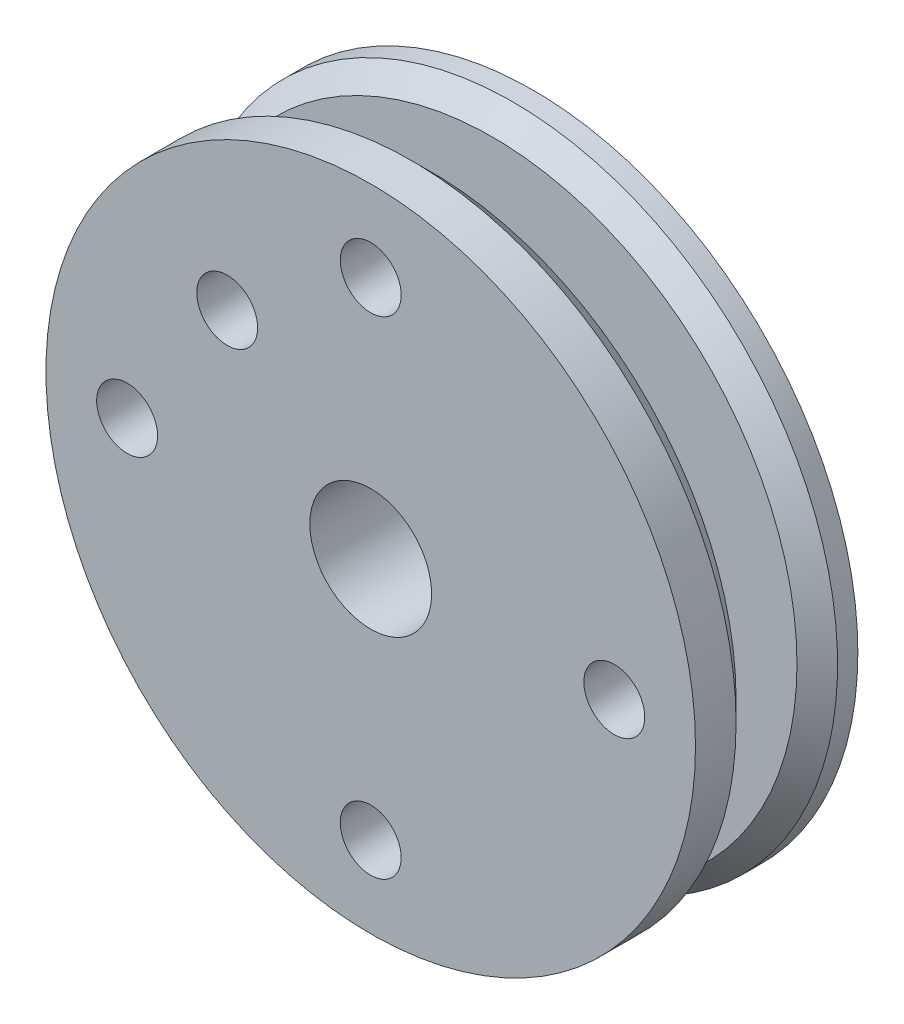
ISO-10303-21;
HEADER;
FILE_DESCRIPTION(('STEP AP214'),'2;1');
FILE_NAME('part.step','',(''),(''),'','','');
FILE_SCHEMA(('AUTOMOTIVE_DESIGN { 1 0 10303 214 1 1 1 1 }'));
ENDSEC;
DATA;
#1=APPLICATION_CONTEXT('core data for automotive mechanical design processes');
#2=APPLICATION_PROTOCOL_DEFINITION('international standard','automotive_design',2000,#1);
#3=PRODUCT_CONTEXT('',#1,'mechanical');
#4=PRODUCT('Part','Part','',(#3));
#5=PRODUCT_RELATED_PRODUCT_CATEGORY('part','',(#4));
#6=PRODUCT_DEFINITION_FORMATION('','',#4);
#7=PRODUCT_DEFINITION_CONTEXT('part definition',#1,'design');
#8=PRODUCT_DEFINITION('design','',#6,#7);
#9=PRODUCT_DEFINITION_SHAPE('','',#8);
#10=(LENGTH_UNIT() NAMED_UNIT(*) SI_UNIT(.MILLI.,.METRE.));
#11=(NAMED_UNIT(*) PLANE_ANGLE_UNIT() SI_UNIT($,.RADIAN.));
#12=(NAMED_UNIT(*) SI_UNIT($,.STERADIAN.) SOLID_ANGLE_UNIT());
#13=UNCERTAINTY_MEASURE_WITH_UNIT(LENGTH_MEASURE(1.E-05),#10,'distance_accuracy_value','');
#14=(GEOMETRIC_REPRESENTATION_CONTEXT(3) GLOBAL_UNCERTAINTY_ASSIGNED_CONTEXT((#13)) GLOBAL_UNIT_ASSIGNED_CONTEXT((#10,
#11,#12)) REPRESENTATION_CONTEXT('',''));
#15=CARTESIAN_POINT('',(0.,0.,0.));
#16=DIRECTION('',(0.,0.,1.));
#17=DIRECTION('',(1.,0.,0.));
#18=AXIS2_PLACEMENT_3D('',#15,#16,#17);
#19=CARTESIAN_POINT('',(0.,0.,4.));
#20=DIRECTION('',(0.,0.,-1.));
#21=DIRECTION('',(-1.,0.,0.));
#22=AXIS2_PLACEMENT_3D('',#19,#20,#21);
#23=CYLINDRICAL_SURFACE('',#22,8.);
#24=CARTESIAN_POINT('',(0.,0.,3.));
#25=DIRECTION('',(0.,0.,1.));
#26=DIRECTION('',(1.,0.,0.));
#27=AXIS2_PLACEMENT_3D('',#24,#25,#26);
#28=CIRCLE('',#27,8.);
#29=CARTESIAN_POINT('',(8.,0.,3.));
#30=VERTEX_POINT('',#29);
#31=EDGE_CURVE('E11',#30,#30,#28,.T.);
#32=ORIENTED_EDGE('',*,*,#31,.T.);
#33=EDGE_LOOP('',(#32));
#34=FACE_BOUND('',#33,.T.);
#35=CARTESIAN_POINT('',(0.,0.,4.));
#36=DIRECTION('',(0.,0.,1.));
#37=DIRECTION('',(1.,0.,0.));
#38=AXIS2_PLACEMENT_3D('',#35,#36,#37);
#39=CIRCLE('',#38,8.);
#40=CARTESIAN_POINT('',(8.,0.,4.));
#41=VERTEX_POINT('',#40);
#42=EDGE_CURVE('E71',#41,#41,#39,.T.);
#43=ORIENTED_EDGE('',*,*,#42,.F.);
#44=EDGE_LOOP('',(#43));
#45=FACE_BOUND('',#44,.T.);
#46=ADVANCED_FACE('F38',(#34,#45),#23,.T.);
#47=CARTESIAN_POINT('',(0.,0.,0.499999999999998));
#48=DIRECTION('',(0.,0.,-1.));
#49=DIRECTION('',(-1.,0.,0.));
#50=AXIS2_PLACEMENT_3D('',#47,#48,#49);
#51=CIRCLE('',#50,8.);
#52=CARTESIAN_POINT('',(-8.,0.,0.499999999999998));
#53=VERTEX_POINT('',#52);
#54=EDGE_CURVE('E105',#53,#53,#51,.T.);
#55=ORIENTED_EDGE('',*,*,#54,.T.);
#56=EDGE_LOOP('',(#55));
#57=FACE_BOUND('',#56,.T.);
#58=CARTESIAN_POINT('',(0.,0.,0.));
#59=DIRECTION('',(0.,0.,1.));
#60=DIRECTION('',(1.,0.,0.));
#61=AXIS2_PLACEMENT_3D('',#58,#59,#60);
#62=CIRCLE('',#61,8.);
#63=CARTESIAN_POINT('',(8.,0.,0.));
#64=VERTEX_POINT('',#63);
#65=EDGE_CURVE('E95',#64,#64,#62,.T.);
#66=ORIENTED_EDGE('',*,*,#65,.T.);
#67=EDGE_LOOP('',(#66));
#68=FACE_BOUND('',#67,.T.);
#69=ADVANCED_FACE('F128',(#57,#68),#23,.T.);
#70=CARTESIAN_POINT('',(0.,0.,4.));
#71=DIRECTION('',(0.,0.,1.));
#72=DIRECTION('',(1.,0.,0.));
#73=AXIS2_PLACEMENT_3D('',#70,#71,#72);
#74=PLANE('',#73);
#75=CARTESIAN_POINT('',(-3.53553390593274,3.53553390593273,4.));
#76=DIRECTION('',(0.,0.,1.));
#77=DIRECTION('',(1.,0.,0.));
#78=AXIS2_PLACEMENT_3D('',#75,#76,#77);
#79=CIRCLE('',#78,0.749999999999999);
#80=CARTESIAN_POINT('',(-2.78553390593274,3.53553390593273,4.));
#81=VERTEX_POINT('',#80);
#82=EDGE_CURVE('E81',#81,#81,#79,.T.);
#83=ORIENTED_EDGE('',*,*,#82,.F.);
#84=EDGE_LOOP('',(#83));
#85=FACE_BOUND('',#84,.T.);
#86=CARTESIAN_POINT('',(-6.,0.,4.));
#87=DIRECTION('',(0.,0.,1.));
#88=DIRECTION('',(1.,0.,0.));
#89=AXIS2_PLACEMENT_3D('',#86,#87,#88);
#90=CIRCLE('',#89,0.750000000000116);
#91=CARTESIAN_POINT('',(-5.24999999999988,0.,4.));
#92=VERTEX_POINT('',#91);
#93=EDGE_CURVE('E177',#92,#92,#90,.F.);
#94=ORIENTED_EDGE('',*,*,#93,.T.);
#95=EDGE_LOOP('',(#94));
#96=FACE_BOUND('',#95,.T.);
#97=CARTESIAN_POINT('',(0.,-6.,4.));
#98=DIRECTION('',(0.,0.,1.));
#99=DIRECTION('',(1.,0.,0.));
#100=AXIS2_PLACEMENT_3D('',#97,#98,#99);
#101=CIRCLE('',#100,0.750000000000337);
#102=CARTESIAN_POINT('',(0.750000000000338,-6.,4.));
#103=VERTEX_POINT('',#102);
#104=EDGE_CURVE('E171',#103,#103,#101,.F.);
#105=ORIENTED_EDGE('',*,*,#104,.T.);
#106=EDGE_LOOP('',(#105));
#107=FACE_BOUND('',#106,.T.);
#108=CARTESIAN_POINT('',(6.,0.,4.));
#109=DIRECTION('',(0.,0.,1.));
#110=DIRECTION('',(1.,0.,0.));
#111=AXIS2_PLACEMENT_3D('',#108,#109,#110);
#112=CIRCLE('',#111,0.750000000000219);
#113=CARTESIAN_POINT('',(6.75000000000022,0.,4.));
#114=VERTEX_POINT('',#113);
#115=EDGE_CURVE('E165',#114,#114,#112,.F.);
#116=ORIENTED_EDGE('',*,*,#115,.T.);
#117=EDGE_LOOP('',(#116));
#118=FACE_BOUND('',#117,.T.);
#119=CARTESIAN_POINT('',(0.,6.,4.));
#120=DIRECTION('',(0.,0.,1.));
#121=DIRECTION('',(1.,0.,0.));
#122=AXIS2_PLACEMENT_3D('',#119,#120,#121);
#123=CIRCLE('',#122,0.75);
#124=CARTESIAN_POINT('',(0.75,6.,4.));
#125=VERTEX_POINT('',#124);
#126=EDGE_CURVE('E159',#125,#125,#123,.F.);
#127=ORIENTED_EDGE('',*,*,#126,.T.);
#128=EDGE_LOOP('',(#127));
#129=FACE_BOUND('',#128,.T.);
#130=CARTESIAN_POINT('',(0.,0.,4.));
#131=DIRECTION('',(0.,0.,-1.));
#132=DIRECTION('',(-1.,0.,0.));
#133=AXIS2_PLACEMENT_3D('',#130,#131,#132);
#134=CIRCLE('',#133,1.5);
#135=CARTESIAN_POINT('',(-1.5,0.,4.));
#136=VERTEX_POINT('',#135);
#137=EDGE_CURVE('E92',#136,#136,#134,.T.);
#138=ORIENTED_EDGE('',*,*,#137,.T.);
#139=EDGE_LOOP('',(#138));
#140=FACE_BOUND('',#139,.T.);
#141=ORIENTED_EDGE('',*,*,#42,.T.);
#142=EDGE_LOOP('',(#141));
#143=FACE_BOUND('',#142,.T.);
#144=ADVANCED_FACE('F134',(#85,#96,#107,#118,#129,#140,#143),#74,.T.);
#145=CARTESIAN_POINT('',(0.,0.,0.));
#146=DIRECTION('',(0.,0.,1.));
#147=DIRECTION('',(1.,0.,0.));
#148=AXIS2_PLACEMENT_3D('',#145,#146,#147);
#149=PLANE('',#148);
#150=CARTESIAN_POINT('',(-3.53553390593274,3.53553390593273,0.));
#151=DIRECTION('',(0.,0.,-1.));
#152=DIRECTION('',(-1.,0.,0.));
#153=AXIS2_PLACEMENT_3D('',#150,#151,#152);
#154=CIRCLE('',#153,0.75);
#155=CARTESIAN_POINT('',(-4.28553390593274,3.53553390593273,0.));
#156=VERTEX_POINT('',#155);
#157=EDGE_CURVE('E76',#156,#156,#154,.T.);
#158=ORIENTED_EDGE('',*,*,#157,.F.);
#159=EDGE_LOOP('',(#158));
#160=FACE_BOUND('',#159,.T.);
#161=CARTESIAN_POINT('',(0.,0.,0.));
#162=DIRECTION('',(0.,0.,-1.));
#163=DIRECTION('',(-1.,0.,0.));
#164=AXIS2_PLACEMENT_3D('',#161,#162,#163);
#165=CIRCLE('',#164,1.49999999999999);
#166=CARTESIAN_POINT('',(-1.49999999999999,0.,0.));
#167=VERTEX_POINT('',#166);
#168=EDGE_CURVE('E84',#167,#167,#165,.T.);
#169=ORIENTED_EDGE('',*,*,#168,.F.);
#170=EDGE_LOOP('',(#169));
#171=FACE_BOUND('',#170,.T.);
#172=ORIENTED_EDGE('',*,*,#65,.F.);
#173=EDGE_LOOP('',(#172));
#174=FACE_BOUND('',#173,.T.);
#175=ADVANCED_FACE('F138',(#160,#171,#174),#149,.F.);
#176=CARTESIAN_POINT('',(0.,0.,0.));
#177=DIRECTION('',(0.,0.,-1.));
#178=DIRECTION('',(-1.,0.,0.));
#179=AXIS2_PLACEMENT_3D('',#176,#177,#178);
#180=CYLINDRICAL_SURFACE('',#179,1.49999999999999);
#181=ORIENTED_EDGE('',*,*,#137,.F.);
#182=EDGE_LOOP('',(#181));
#183=FACE_BOUND('',#182,.T.);
#184=ORIENTED_EDGE('',*,*,#168,.T.);
#185=EDGE_LOOP('',(#184));
#186=FACE_BOUND('',#185,.T.);
#187=ADVANCED_FACE('F187',(#183,#186),#180,.F.);
#188=CARTESIAN_POINT('',(-4.5,0.,2.5));
#189=DIRECTION('',(0.,0.,1.));
#190=DIRECTION('',(1.,0.,0.));
#191=AXIS2_PLACEMENT_3D('',#188,#189,#190);
#192=PLANE('',#191);
#193=CARTESIAN_POINT('',(0.,6.,2.5));
#194=DIRECTION('',(0.,0.,1.));
#195=DIRECTION('',(1.,0.,0.));
#196=AXIS2_PLACEMENT_3D('',#193,#194,#195);
#197=CIRCLE('',#196,0.75);
#198=CARTESIAN_POINT('',(0.75,6.,2.5));
#199=VERTEX_POINT('',#198);
#200=EDGE_CURVE('E162',#199,#199,#197,.F.);
#201=ORIENTED_EDGE('',*,*,#200,.F.);
#202=EDGE_LOOP('',(#201));
#203=FACE_BOUND('',#202,.T.);
#204=CARTESIAN_POINT('',(6.,0.,2.5));
#205=DIRECTION('',(0.,0.,1.));
#206=DIRECTION('',(1.,0.,0.));
#207=AXIS2_PLACEMENT_3D('',#204,#205,#206);
#208=CIRCLE('',#207,0.750000000000219);
#209=CARTESIAN_POINT('',(6.75000000000022,0.,2.5));
#210=VERTEX_POINT('',#209);
#211=EDGE_CURVE('E168',#210,#210,#208,.F.);
#212=ORIENTED_EDGE('',*,*,#211,.F.);
#213=EDGE_LOOP('',(#212));
#214=FACE_BOUND('',#213,.T.);
#215=CARTESIAN_POINT('',(0.,-6.,2.5));
#216=DIRECTION('',(0.,0.,1.));
#217=DIRECTION('',(1.,0.,0.));
#218=AXIS2_PLACEMENT_3D('',#215,#216,#217);
#219=CIRCLE('',#218,0.750000000000337);
#220=CARTESIAN_POINT('',(0.750000000000338,-6.,2.5));
#221=VERTEX_POINT('',#220);
#222=EDGE_CURVE('E174',#221,#221,#219,.F.);
#223=ORIENTED_EDGE('',*,*,#222,.F.);
#224=EDGE_LOOP('',(#223));
#225=FACE_BOUND('',#224,.T.);
#226=CARTESIAN_POINT('',(-6.,0.,2.5));
#227=DIRECTION('',(0.,0.,1.));
#228=DIRECTION('',(1.,0.,0.));
#229=AXIS2_PLACEMENT_3D('',#226,#227,#228);
#230=CIRCLE('',#229,0.750000000000116);
#231=CARTESIAN_POINT('',(-5.24999999999988,0.,2.5));
#232=VERTEX_POINT('',#231);
#233=EDGE_CURVE('E180',#232,#232,#230,.F.);
#234=ORIENTED_EDGE('',*,*,#233,.F.);
#235=EDGE_LOOP('',(#234));
#236=FACE_BOUND('',#235,.T.);
#237=CARTESIAN_POINT('',(0.,0.,2.5));
#238=DIRECTION('',(0.,0.,1.));
#239=DIRECTION('',(1.,0.,0.));
#240=AXIS2_PLACEMENT_3D('',#237,#238,#239);
#241=CIRCLE('',#240,7.5);
#242=CARTESIAN_POINT('',(7.5,0.,2.5));
#243=VERTEX_POINT('',#242);
#244=EDGE_CURVE('E47',#243,#243,#241,.F.);
#245=ORIENTED_EDGE('',*,*,#244,.T.);
#246=EDGE_LOOP('',(#245));
#247=FACE_BOUND('',#246,.T.);
#248=CARTESIAN_POINT('',(0.,0.,2.5));
#249=DIRECTION('',(0.,0.,-1.));
#250=DIRECTION('',(-1.,0.,0.));
#251=AXIS2_PLACEMENT_3D('',#248,#249,#250);
#252=CIRCLE('',#251,4.5);
#253=CARTESIAN_POINT('',(-2.78553503621767,3.5342318206371,2.5));
#254=VERTEX_POINT('',#253);
#255=CARTESIAN_POINT('',(-3.5342318206371,2.78553503621766,2.5));
#256=VERTEX_POINT('',#255);
#257=EDGE_CURVE('E80',#254,#256,#252,.T.);
#258=ORIENTED_EDGE('',*,*,#257,.F.);
#259=CARTESIAN_POINT('',(-3.53553390593274,3.53553390593273,2.5));
#260=DIRECTION('',(0.,0.,1.));
#261=DIRECTION('',(1.,0.,0.));
#262=AXIS2_PLACEMENT_3D('',#259,#260,#261);
#263=CIRCLE('',#262,0.749999999999999);
#264=EDGE_CURVE('E53',#254,#256,#263,.T.);
#265=ORIENTED_EDGE('',*,*,#264,.T.);
#266=EDGE_LOOP('',(#258,#265));
#267=FACE_BOUND('',#266,.T.);
#268=ADVANCED_FACE('F125',(#203,#214,#225,#236,#247,#267),#192,.F.);
#269=CARTESIAN_POINT('',(0.,0.,1.75));
#270=DIRECTION('',(0.,0.,-1.));
#271=DIRECTION('',(-1.,0.,0.));
#272=AXIS2_PLACEMENT_3D('',#269,#270,#271);
#273=TOROIDAL_SURFACE('',#272,4.5,0.75);
#274=CARTESIAN_POINT('',(0.,0.,1.));
#275=DIRECTION('',(0.,0.,-1.));
#276=DIRECTION('',(-1.,0.,0.));
#277=AXIS2_PLACEMENT_3D('',#274,#275,#276);
#278=CIRCLE('',#277,4.5);
#279=CARTESIAN_POINT('',(-2.78553503621767,3.5342318206371,1.));
#280=VERTEX_POINT('',#279);
#281=CARTESIAN_POINT('',(-3.53423182063711,2.78553503621766,1.));
#282=VERTEX_POINT('',#281);
#283=EDGE_CURVE('E75',#280,#282,#278,.T.);
#284=ORIENTED_EDGE('',*,*,#283,.F.);
#285=CARTESIAN_POINT('',(-4.04510268999947,2.98522521591183,1.21672392239653));
#286=CARTESIAN_POINT('',(-4.06717729077215,3.00566717869359,1.24629697173725));
#287=CARTESIAN_POINT('',(-4.0862862095507,3.0258323829536,1.27833603759019));
#288=CARTESIAN_POINT('',(-4.1191133993598,3.06376132873869,1.34646447260618));
#289=CARTESIAN_POINT('',(-4.13281249623848,3.08151638461191,1.38256767576369));
#290=CARTESIAN_POINT('',(-4.1554031884755,3.11288099014642,1.45789981383957));
#291=CARTESIAN_POINT('',(-4.16430077443588,3.12649569620781,1.49712478341001));
#292=CARTESIAN_POINT('',(-4.17784861333492,3.14811017818971,1.57774227922166));
#293=CARTESIAN_POINT('',(-4.18250611800452,3.15611953538491,1.61913097615957));
#294=CARTESIAN_POINT('',(-4.18787702646684,3.16542867971578,1.70197036479742));
#295=CARTESIAN_POINT('',(-4.18867701745432,3.16687572220384,1.74339860395725));
#296=CARTESIAN_POINT('',(-4.18662555308701,3.16326584899753,1.82588256795789));
#297=CARTESIAN_POINT('',(-4.18377348855823,3.15820784824155,1.86693822950111));
#298=CARTESIAN_POINT('',(-4.17447896139487,3.14269354716693,1.94515781962672));
#299=CARTESIAN_POINT('',(-4.16824553342278,3.13255393113343,1.98241110778135));
#300=CARTESIAN_POINT('',(-4.15197356728305,3.10807962130967,2.05465920475893));
#301=CARTESIAN_POINT('',(-4.14193201512538,3.09374160669523,2.0896521989017));
#302=CARTESIAN_POINT('',(-4.1166190052481,3.06087327537419,2.15927957845452));
#303=CARTESIAN_POINT('',(-4.1010032939683,3.04210457661932,2.19367717671397));
#304=CARTESIAN_POINT('',(-4.06415456070398,3.00282143975847,2.2582020631693));
#305=CARTESIAN_POINT('',(-4.04292710017696,2.98230874359962,2.28833353411007));
#306=CARTESIAN_POINT('',(-3.99912113127719,2.94541529631747,2.33805072956879));
#307=CARTESIAN_POINT('',(-3.97760395505507,2.92900508830982,2.3585482635332));
#308=CARTESIAN_POINT('',(-3.93064778944032,2.89742499802712,2.39563363757993));
#309=CARTESIAN_POINT('',(-3.90521258139886,2.8822539412061,2.4122252087382));
#310=CARTESIAN_POINT('',(-3.85064921985029,2.8542513201113,2.44115602073586));
#311=CARTESIAN_POINT('',(-3.82150294592376,2.84143204405778,2.45347321013864));
#312=CARTESIAN_POINT('',(-3.7604471806025,2.81931691558425,2.47359601928976));
#313=CARTESIAN_POINT('',(-3.72853806179355,2.81002058898023,2.48140224628153));
#314=CARTESIAN_POINT('',(-3.66577591496567,2.79628814527007,2.49235567473132));
#315=CARTESIAN_POINT('',(-3.63505178051287,2.79151525369191,2.4958331827439));
#316=CARTESIAN_POINT('',(-3.57307011608744,2.78582695476155,2.49983368003298));
#317=CARTESIAN_POINT('',(-3.54181245055192,2.78491254289812,2.50035590685804));
#318=CARTESIAN_POINT('',(-3.47701316612066,2.78706323291142,2.49915450269042));
#319=CARTESIAN_POINT('',(-3.44348668957354,2.79044919140579,2.49724975600017));
#320=CARTESIAN_POINT('',(-3.37729731572848,2.80164667340357,2.49192636124723));
#321=CARTESIAN_POINT('',(-3.34463524817528,2.8094622983889,2.48850631078788));
#322=CARTESIAN_POINT('',(-3.27469683868258,2.83123008816232,2.4805183400338));
#323=CARTESIAN_POINT('',(-3.2377010772679,2.84605702603195,2.4758553861769));
#324=CARTESIAN_POINT('',(-3.16643750977311,2.88143145838997,2.46750247461733));
#325=CARTESIAN_POINT('',(-3.13216919522129,2.90197788337997,2.46381233525707));
#326=CARTESIAN_POINT('',(-3.06543920355788,2.94963389251219,2.45852407464223));
#327=CARTESIAN_POINT('',(-3.03317678936771,2.97703937141084,2.45705048564348));
#328=CARTESIAN_POINT('',(-2.97373356141047,3.03687712770187,2.45716647955456));
#329=CARTESIAN_POINT('',(-2.94655151278459,3.0693081800388,2.45875531703088));
#330=CARTESIAN_POINT('',(-2.89977892924593,3.13571898045636,2.46417386186616));
#331=CARTESIAN_POINT('',(-2.8797936333016,3.16943689841916,2.46784115376258));
#332=CARTESIAN_POINT('',(-2.84531863957078,3.23951031220025,2.47608145983493));
#333=CARTESIAN_POINT('',(-2.83083570935943,3.27586899097725,2.48065557890321));
#334=CARTESIAN_POINT('',(-2.80682718041667,3.35320500797966,2.48948146570783));
#335=CARTESIAN_POINT('',(-2.7977412633187,3.39432569251424,2.49368523992095));
#336=CARTESIAN_POINT('',(-2.78659356228482,3.47768168250918,2.49928041775109));
#337=CARTESIAN_POINT('',(-2.78451858382805,3.51991474328379,2.50067710227426));
#338=CARTESIAN_POINT('',(-2.78713718268779,3.59425487730568,2.4989042942914));
#339=CARTESIAN_POINT('',(-2.79037129233799,3.62643664586311,2.49671955089322));
#340=CARTESIAN_POINT('',(-2.80084957114507,3.68968833013551,2.48878781496174));
#341=CARTESIAN_POINT('',(-2.80809041842573,3.7207591442246,2.4830437728733));
#342=CARTESIAN_POINT('',(-2.82610770476633,3.78089606390069,2.46754033247466));
#343=CARTESIAN_POINT('',(-2.83689268801896,3.80995711737114,2.4577712159372));
#344=CARTESIAN_POINT('',(-2.86117178612405,3.86514863908592,2.4341618669928));
#345=CARTESIAN_POINT('',(-2.87466688551493,3.89127803691776,2.42032015422949));
#346=CARTESIAN_POINT('',(-2.90290618356513,3.93931068747708,2.3893289877015));
#347=CARTESIAN_POINT('',(-2.91759899338191,3.96131946207919,2.37229477228787));
#348=CARTESIAN_POINT('',(-2.94764163949713,4.00192591903944,2.33505761634642));
#349=CARTESIAN_POINT('',(-2.96299165742102,4.02052265084521,2.31485379570551));
#350=CARTESIAN_POINT('',(-2.99537550246075,4.05648021175623,2.26901690010011));
#351=CARTESIAN_POINT('',(-3.01238208835771,4.07340181339751,2.2430212492422));
#352=CARTESIAN_POINT('',(-3.04503994573193,4.10334327447574,2.18808610874205));
#353=CARTESIAN_POINT('',(-3.06068999057167,4.11635962827494,2.15914400516968));
#354=CARTESIAN_POINT('',(-3.09204061345144,4.14073783664359,2.09376660112294));
#355=CARTESIAN_POINT('',(-3.10731525390477,4.15146279789241,2.05688623028379));
#356=CARTESIAN_POINT('',(-3.13318441015181,4.16866728283483,1.9805791236431));
#357=CARTESIAN_POINT('',(-3.1437796792331,4.17514748993234,1.94115279886268));
#358=CARTESIAN_POINT('',(-3.15928105293146,4.1843943395421,1.85977707540637));
#359=CARTESIAN_POINT('',(-3.16404797695366,4.18707037229092,1.81779019746059));
#360=CARTESIAN_POINT('',(-3.16677771132177,4.18862060265157,1.7335381209336));
#361=CARTESIAN_POINT('',(-3.16474363590982,4.18749654036034,1.69127305858203));
#362=CARTESIAN_POINT('',(-3.15456462531577,4.18159218142042,1.6109771871636));
#363=CARTESIAN_POINT('',(-3.14688415948942,4.1770892734431,1.5728648433846));
#364=CARTESIAN_POINT('',(-3.12678365717724,4.16447184649935,1.49851912101326));
#365=CARTESIAN_POINT('',(-3.11435997592737,4.15635454937783,1.4622872117588));
#366=CARTESIAN_POINT('',(-3.08515431462919,4.13553071962134,1.39058275813385));
#367=CARTESIAN_POINT('',(-3.06817365423013,4.12260058008441,1.35525619085503));
#368=CARTESIAN_POINT('',(-3.03174108012698,4.09164775181131,1.28829833807845));
#369=CARTESIAN_POINT('',(-3.0122903289454,4.07362745385203,1.25666532760318));
#370=CARTESIAN_POINT('',(-2.97534124374876,4.03483220988724,1.20196976263148));
#371=CARTESIAN_POINT('',(-2.95794431428212,4.01478152917751,1.17832692433109));
#372=CARTESIAN_POINT('',(-2.92378476081976,3.97032860808841,1.1349963470142));
#373=CARTESIAN_POINT('',(-2.90702161586172,3.94593004021812,1.11530529967242));
#374=CARTESIAN_POINT('',(-2.87534759057314,3.89276784116333,1.08032389626391));
#375=CARTESIAN_POINT('',(-2.86045023172612,3.86397536335853,1.06506471409409));
#376=CARTESIAN_POINT('',(-2.83400879148971,3.80286778097585,1.0395067589304));
#377=CARTESIAN_POINT('',(-2.82246267866303,3.77055482682691,1.02920497838736));
#378=CARTESIAN_POINT('',(-2.80486443809347,3.70748779290853,1.01434511376668));
#379=CARTESIAN_POINT('',(-2.79832970647856,3.67698909486667,1.00925858798338));
#380=CARTESIAN_POINT('',(-2.78910512507472,3.61506102375054,1.00239184446209));
#381=CARTESIAN_POINT('',(-2.78641615516224,3.58363143937599,1.00061238332353));
#382=CARTESIAN_POINT('',(-2.78499427228183,3.51951620368477,0.9996389682565));
#383=CARTESIAN_POINT('',(-2.78640909336443,3.48682651698098,1.00054159619901));
#384=CARTESIAN_POINT('',(-2.79345719938838,3.42201296200657,1.00420947153978));
#385=CARTESIAN_POINT('',(-2.79909343582755,3.38988950572039,1.00697602200552));
#386=CARTESIAN_POINT('',(-2.81583577220437,3.32104727862002,1.01398448441842));
#387=CARTESIAN_POINT('',(-2.82774291223939,3.28454028832349,1.01840219669601));
#388=CARTESIAN_POINT('',(-2.85699734859988,3.21373094331484,1.02696636160819));
#389=CARTESIAN_POINT('',(-2.87434684488346,3.1794294869119,1.03111270372642));
#390=CARTESIAN_POINT('',(-2.91626498183428,3.11032673966265,1.03816717669049));
#391=CARTESIAN_POINT('',(-2.94139690234494,3.07584472976321,1.04090160468061));
#392=CARTESIAN_POINT('',(-2.99719966414057,3.01160278879755,1.04335485739385));
#393=CARTESIAN_POINT('',(-3.02786629216893,2.98183929794412,1.0430759665431));
#394=CARTESIAN_POINT('',(-3.09131478026896,2.92995263940438,1.03975240912155));
#395=CARTESIAN_POINT('',(-3.12378671324222,2.90743435531163,1.03690774561205));
#396=CARTESIAN_POINT('',(-3.19175641452373,2.86780072948001,1.02969099866979));
#397=CARTESIAN_POINT('',(-3.22725793386022,2.85069221270661,1.02531700035329));
#398=CARTESIAN_POINT('',(-3.30216614343711,2.82158133620605,1.01628807077745));
#399=CARTESIAN_POINT('',(-3.34167719675086,2.80984847778146,1.01162944341586));
#400=CARTESIAN_POINT('',(-3.42224517806732,2.79300215231008,1.00413746646274));
#401=CARTESIAN_POINT('',(-3.4633001190971,2.7878804578351,1.0013018503906));
#402=CARTESIAN_POINT('',(-3.53791500627077,2.78479405692953,0.999578218036754));
#403=CARTESIAN_POINT('',(-3.57140934792793,2.78564957681685,1.00003985816939));
#404=CARTESIAN_POINT('',(-3.63776441564927,2.7917895154876,1.00436143271604));
#405=CARTESIAN_POINT('',(-3.67062575866836,2.79706937265686,1.00821786720992));
#406=CARTESIAN_POINT('',(-3.73482084722557,2.811743044293,1.02003277948506));
#407=CARTESIAN_POINT('',(-3.76614730517106,2.82115470104564,1.02800907466642));
#408=CARTESIAN_POINT('',(-3.82607270332069,2.84335689387395,1.04835762265148));
#409=CARTESIAN_POINT('',(-3.85467041256352,2.85614894515731,1.06073184761685));
#410=CARTESIAN_POINT('',(-3.90646668933184,2.88307485928947,1.08870028417482));
#411=CARTESIAN_POINT('',(-3.92990271445303,2.89705290307507,1.10400971048353));
#412=CARTESIAN_POINT('',(-3.97341920730767,2.92607536763664,1.13793962240802));
#413=CARTESIAN_POINT('',(-3.99350357678928,2.94111851901041,1.15655620519008));
#414=CARTESIAN_POINT('',(-4.02364664675977,2.96590410785525,1.18940850176204));
#415=CARTESIAN_POINT('',(-4.03470373816088,2.97559537079514,1.2027925847936));
#416=CARTESIAN_POINT('',(-4.04510268999947,2.98522521591183,1.21672392239653));
#417=B_SPLINE_CURVE_WITH_KNOTS('',3,(#285,#286,#287,#288,#289,#290,#291,#292,#293,#294,#295,
#296,#297,#298,#299,#300,#301,#302,#303,#304,#305,#306,#307,#308,#309,#310,#311,#312,#313,#314,
#315,#316,#317,#318,#319,#320,#321,#322,#323,#324,#325,#326,#327,#328,#329,#330,#331,#332,#333,
#334,#335,#336,#337,#338,#339,#340,#341,#342,#343,#344,#345,#346,#347,#348,#349,#350,#351,#352,
#353,#354,#355,#356,#357,#358,#359,#360,#361,#362,#363,#364,#365,#366,#367,#368,#369,#370,#371,
#372,#373,#374,#375,#376,#377,#378,#379,#380,#381,#382,#383,#384,#385,#386,#387,#388,#389,#390,
#391,#392,#393,#394,#395,#396,#397,#398,#399,#400,#401,#402,#403,#404,#405,#406,#407,#408,#409,
#410,#411,#412,#413,#414,#415,#416),.UNSPECIFIED.,.T.,.F.,(4,2,2,2,2,2,2,2,2,2,2,2,2,2,2,2,2,2,
2,2,2,2,2,2,2,2,2,2,2,2,2,2,2,2,2,2,2,2,2,2,2,2,2,2,2,2,2,2,2,2,2,2,2,2,2,2,2,2,2,2,2,2,2,2,2,
4),(0.,0.126496903833787,0.253438213727164,0.380220777041031,0.506786096934219,
0.630496824075356,0.754228189230404,0.871061354340255,0.987987182234752,1.11395083759231,
1.23979012312185,1.34121249020596,1.4425375793331,1.54437789106712,1.64620449036685,
1.73965852740406,1.83313667413285,1.93401700617905,2.03499089750027,2.15486402992231,
2.27471476206649,2.40107604928899,2.52740658245367,2.64500844817787,2.76275449235544,
2.88910626730704,3.01522011655289,3.11205716687719,3.20881405228912,3.30580593147174,
3.40283311007897,3.49686650897118,3.59092606474479,3.69664952303365,3.80246760445911,
3.92591458193077,4.04934167959515,4.17566201184495,4.3019245087396,4.4188213866657,
4.53580827143898,4.6590953814622,4.78232468124989,4.88853326869141,4.99465256702092,
5.1015011728004,5.20828487384463,5.30265637599505,5.39704946606299,5.4948823477133,
5.5927836953591,5.70828108419208,5.82382522071032,5.95139045999282,6.07885899762425,
6.19717608403871,6.3156418492375,6.43952893997729,6.5632617072184,6.66337023521054,
6.76337567535369,6.86381728180085,6.96430398617975,7.05778194936397,7.15115032164688,
7.21074076336056),.UNSPECIFIED.);
#418=EDGE_CURVE('E65',#280,#282,#417,.T.);
#419=ORIENTED_EDGE('',*,*,#418,.T.);
#420=EDGE_LOOP('',(#284,#419));
#421=FACE_BOUND('',#420,.T.);
#422=ORIENTED_EDGE('',*,*,#257,.T.);
#423=EDGE_CURVE('E70',#256,#254,#417,.T.);
#424=ORIENTED_EDGE('',*,*,#423,.T.);
#425=EDGE_LOOP('',(#422,#424));
#426=FACE_BOUND('',#425,.T.);
#427=ADVANCED_FACE('F78',(#421,#426),#273,.F.);
#428=CARTESIAN_POINT('',(-8.,0.,1.));
#429=DIRECTION('',(0.,0.,-1.));
#430=DIRECTION('',(-1.,0.,0.));
#431=AXIS2_PLACEMENT_3D('',#428,#429,#430);
#432=PLANE('',#431);
#433=CARTESIAN_POINT('',(0.,0.,1.));
#434=DIRECTION('',(0.,0.,-1.));
#435=DIRECTION('',(-1.,0.,0.));
#436=AXIS2_PLACEMENT_3D('',#433,#434,#435);
#437=CIRCLE('',#436,7.5);
#438=CARTESIAN_POINT('',(-7.5,0.,1.));
#439=VERTEX_POINT('',#438);
#440=EDGE_CURVE('E151',#439,#439,#437,.F.);
#441=ORIENTED_EDGE('',*,*,#440,.T.);
#442=EDGE_LOOP('',(#441));
#443=FACE_BOUND('',#442,.T.);
#444=ORIENTED_EDGE('',*,*,#283,.T.);
#445=CARTESIAN_POINT('',(-3.53553390593274,3.53553390593273,1.));
#446=DIRECTION('',(0.,0.,-1.));
#447=DIRECTION('',(-1.,0.,0.));
#448=AXIS2_PLACEMENT_3D('',#445,#446,#447);
#449=CIRCLE('',#448,0.749999999999999);
#450=EDGE_CURVE('E60',#282,#280,#449,.T.);
#451=ORIENTED_EDGE('',*,*,#450,.T.);
#452=EDGE_LOOP('',(#444,#451));
#453=FACE_BOUND('',#452,.T.);
#454=ADVANCED_FACE('F74',(#443,#453),#432,.F.);
#455=CARTESIAN_POINT('',(-3.53553390593274,3.53553390593273,0.));
#456=DIRECTION('',(0.,0.,-1.));
#457=DIRECTION('',(-1.,0.,0.));
#458=AXIS2_PLACEMENT_3D('',#455,#456,#457);
#459=CYLINDRICAL_SURFACE('',#458,0.749999999999999);
#460=ORIENTED_EDGE('',*,*,#157,.T.);
#461=EDGE_LOOP('',(#460));
#462=FACE_BOUND('',#461,.T.);
#463=ORIENTED_EDGE('',*,*,#418,.F.);
#464=ORIENTED_EDGE('',*,*,#450,.F.);
#465=EDGE_LOOP('',(#463,#464));
#466=FACE_BOUND('',#465,.T.);
#467=ADVANCED_FACE('F66',(#462,#466),#459,.F.);
#468=ORIENTED_EDGE('',*,*,#82,.T.);
#469=EDGE_LOOP('',(#468));
#470=FACE_BOUND('',#469,.T.);
#471=ORIENTED_EDGE('',*,*,#423,.F.);
#472=ORIENTED_EDGE('',*,*,#264,.F.);
#473=EDGE_LOOP('',(#471,#472));
#474=FACE_BOUND('',#473,.T.);
#475=ADVANCED_FACE('F110',(#470,#474),#459,.F.);
#476=CARTESIAN_POINT('',(0.,0.,0.499999999999998));
#477=DIRECTION('',(0.,0.,-1.));
#478=DIRECTION('',(-1.,0.,0.));
#479=AXIS2_PLACEMENT_3D('',#476,#477,#478);
#480=CONICAL_SURFACE('',#479,8.,0.785398163397448);
#481=ORIENTED_EDGE('',*,*,#440,.F.);
#482=EDGE_LOOP('',(#481));
#483=FACE_BOUND('',#482,.T.);
#484=ORIENTED_EDGE('',*,*,#54,.F.);
#485=EDGE_LOOP('',(#484));
#486=FACE_BOUND('',#485,.T.);
#487=ADVANCED_FACE('F114',(#483,#486),#480,.T.);
#488=CARTESIAN_POINT('',(0.,0.,2.5));
#489=DIRECTION('',(0.,0.,1.));
#490=DIRECTION('',(1.,0.,0.));
#491=AXIS2_PLACEMENT_3D('',#488,#489,#490);
#492=CONICAL_SURFACE('',#491,7.5,0.785398163397445);
#493=ORIENTED_EDGE('',*,*,#31,.F.);
#494=EDGE_LOOP('',(#493));
#495=FACE_BOUND('',#494,.T.);
#496=ORIENTED_EDGE('',*,*,#244,.F.);
#497=EDGE_LOOP('',(#496));
#498=FACE_BOUND('',#497,.T.);
#499=ADVANCED_FACE('F41',(#495,#498),#492,.T.);
#500=CARTESIAN_POINT('',(-6.,0.,7.));
#501=DIRECTION('',(0.,0.,-1.));
#502=DIRECTION('',(-1.,0.,0.));
#503=AXIS2_PLACEMENT_3D('',#500,#501,#502);
#504=CYLINDRICAL_SURFACE('',#503,0.750000000000116);
#505=ORIENTED_EDGE('',*,*,#93,.F.);
#506=EDGE_LOOP('',(#505));
#507=FACE_BOUND('',#506,.T.);
#508=ORIENTED_EDGE('',*,*,#233,.T.);
#509=EDGE_LOOP('',(#508));
#510=FACE_BOUND('',#509,.T.);
#511=ADVANCED_FACE('F116',(#507,#510),#504,.F.);
#512=CARTESIAN_POINT('',(0.,-6.,7.));
#513=DIRECTION('',(0.,0.,-1.));
#514=DIRECTION('',(-1.,0.,0.));
#515=AXIS2_PLACEMENT_3D('',#512,#513,#514);
#516=CYLINDRICAL_SURFACE('',#515,0.750000000000337);
#517=ORIENTED_EDGE('',*,*,#104,.F.);
#518=EDGE_LOOP('',(#517));
#519=FACE_BOUND('',#518,.T.);
#520=ORIENTED_EDGE('',*,*,#222,.T.);
#521=EDGE_LOOP('',(#520));
#522=FACE_BOUND('',#521,.T.);
#523=ADVANCED_FACE('F233',(#519,#522),#516,.F.);
#524=CARTESIAN_POINT('',(6.,0.,7.));
#525=DIRECTION('',(0.,0.,-1.));
#526=DIRECTION('',(-1.,0.,0.));
#527=AXIS2_PLACEMENT_3D('',#524,#525,#526);
#528=CYLINDRICAL_SURFACE('',#527,0.750000000000219);
#529=ORIENTED_EDGE('',*,*,#115,.F.);
#530=EDGE_LOOP('',(#529));
#531=FACE_BOUND('',#530,.T.);
#532=ORIENTED_EDGE('',*,*,#211,.T.);
#533=EDGE_LOOP('',(#532));
#534=FACE_BOUND('',#533,.T.);
#535=ADVANCED_FACE('F228',(#531,#534),#528,.F.);
#536=CARTESIAN_POINT('',(0.,6.,7.));
#537=DIRECTION('',(0.,0.,-1.));
#538=DIRECTION('',(-1.,0.,0.));
#539=AXIS2_PLACEMENT_3D('',#536,#537,#538);
#540=CYLINDRICAL_SURFACE('',#539,0.75);
#541=ORIENTED_EDGE('',*,*,#126,.F.);
#542=EDGE_LOOP('',(#541));
#543=FACE_BOUND('',#542,.T.);
#544=ORIENTED_EDGE('',*,*,#200,.T.);
#545=EDGE_LOOP('',(#544));
#546=FACE_BOUND('',#545,.T.);
#547=ADVANCED_FACE('F225',(#543,#546),#540,.F.);
#548=CLOSED_SHELL('',(#46,#69,#144,#175,#187,#268,#427,#454,#467,#475,#487,#499,#511,#523,#535,#547));
#549=MANIFOLD_SOLID_BREP('B2',#548);
#550=ADVANCED_BREP_SHAPE_REPRESENTATION('',(#18,#549),#14);
#551=SHAPE_DEFINITION_REPRESENTATION(#9,#550);
ENDSEC;
END-ISO-10303-21;
